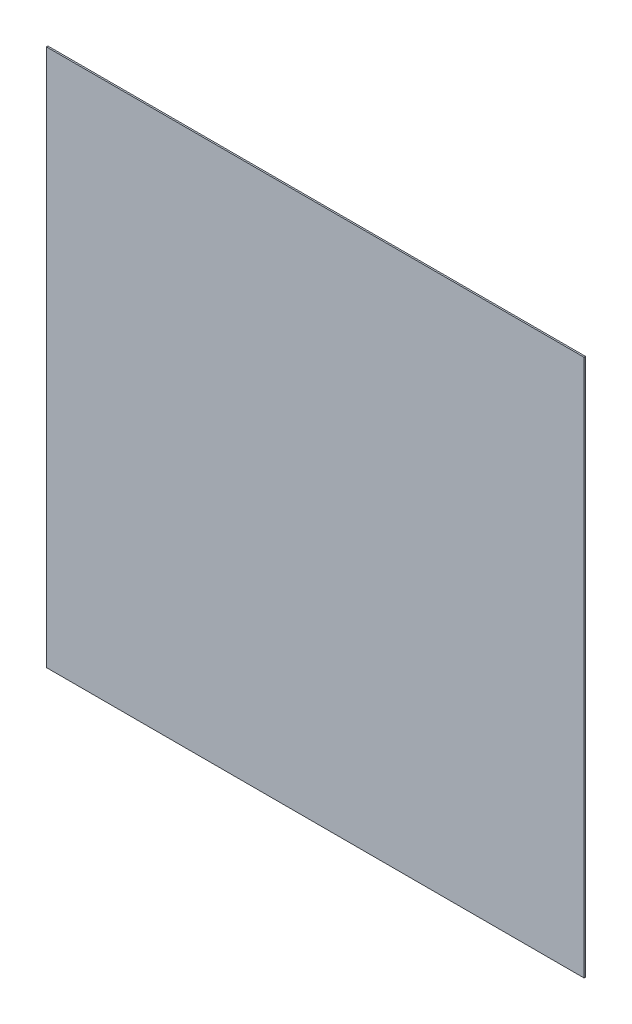
ISO-10303-21;
HEADER;
FILE_DESCRIPTION(('STEP AP214'),'2;1');
FILE_NAME('part.step','',(''),(''),'','','');
FILE_SCHEMA(('AUTOMOTIVE_DESIGN { 1 0 10303 214 1 1 1 1 }'));
ENDSEC;
DATA;
#1=APPLICATION_CONTEXT('core data for automotive mechanical design processes');
#2=APPLICATION_PROTOCOL_DEFINITION('international standard','automotive_design',2000,#1);
#3=PRODUCT_CONTEXT('',#1,'mechanical');
#4=PRODUCT('Part','Part','',(#3));
#5=PRODUCT_RELATED_PRODUCT_CATEGORY('part','',(#4));
#6=PRODUCT_DEFINITION_FORMATION('','',#4);
#7=PRODUCT_DEFINITION_CONTEXT('part definition',#1,'design');
#8=PRODUCT_DEFINITION('design','',#6,#7);
#9=PRODUCT_DEFINITION_SHAPE('','',#8);
#10=(LENGTH_UNIT() NAMED_UNIT(*) SI_UNIT(.MILLI.,.METRE.));
#11=(NAMED_UNIT(*) PLANE_ANGLE_UNIT() SI_UNIT($,.RADIAN.));
#12=(NAMED_UNIT(*) SI_UNIT($,.STERADIAN.) SOLID_ANGLE_UNIT());
#13=UNCERTAINTY_MEASURE_WITH_UNIT(LENGTH_MEASURE(1.E-05),#10,'distance_accuracy_value','');
#14=(GEOMETRIC_REPRESENTATION_CONTEXT(3) GLOBAL_UNCERTAINTY_ASSIGNED_CONTEXT((#13)) GLOBAL_UNIT_ASSIGNED_CONTEXT((#10,
#11,#12)) REPRESENTATION_CONTEXT('',''));
#15=CARTESIAN_POINT('',(0.,0.,0.));
#16=DIRECTION('',(0.,0.,1.));
#17=DIRECTION('',(1.,0.,0.));
#18=AXIS2_PLACEMENT_3D('',#15,#16,#17);
#19=CARTESIAN_POINT('',(900.,1.11022302462516E-13,5.));
#20=DIRECTION('',(1.,0.,0.));
#21=DIRECTION('',(0.,1.,0.));
#22=AXIS2_PLACEMENT_3D('',#19,#20,#21);
#23=PLANE('',#22);
#24=DIRECTION('',(0.,-1.,0.));
#25=VECTOR('',#24,1.);
#26=CARTESIAN_POINT('',(900.,1.11022302462516E-13,0.));
#27=LINE('',#26,#25);
#28=CARTESIAN_POINT('',(900.,900.,0.));
#29=VERTEX_POINT('',#28);
#30=CARTESIAN_POINT('',(900.,-900.,0.));
#31=VERTEX_POINT('',#30);
#32=EDGE_CURVE('E97',#29,#31,#27,.T.);
#33=ORIENTED_EDGE('',*,*,#32,.F.);
#34=DIRECTION('',(0.,0.,-1.));
#35=VECTOR('',#34,1.);
#36=CARTESIAN_POINT('',(900.,900.,5.));
#37=LINE('',#36,#35);
#38=CARTESIAN_POINT('',(900.,900.,5.));
#39=VERTEX_POINT('',#38);
#40=EDGE_CURVE('E11',#39,#29,#37,.T.);
#41=ORIENTED_EDGE('',*,*,#40,.F.);
#42=DIRECTION('',(0.,-1.,0.));
#43=VECTOR('',#42,1.);
#44=CARTESIAN_POINT('',(900.,1.11022302462516E-13,5.));
#45=LINE('',#44,#43);
#46=CARTESIAN_POINT('',(900.,-900.,5.));
#47=VERTEX_POINT('',#46);
#48=EDGE_CURVE('E91',#39,#47,#45,.T.);
#49=ORIENTED_EDGE('',*,*,#48,.T.);
#50=DIRECTION('',(0.,0.,-1.));
#51=VECTOR('',#50,1.);
#52=CARTESIAN_POINT('',(900.,-900.,5.));
#53=LINE('',#52,#51);
#54=EDGE_CURVE('E72',#47,#31,#53,.T.);
#55=ORIENTED_EDGE('',*,*,#54,.T.);
#56=EDGE_LOOP('',(#33,#41,#49,#55));
#57=FACE_BOUND('',#56,.T.);
#58=ADVANCED_FACE('F34',(#57),#23,.T.);
#59=CARTESIAN_POINT('',(0.,900.,5.));
#60=DIRECTION('',(0.,1.,0.));
#61=DIRECTION('',(0.,0.,1.));
#62=AXIS2_PLACEMENT_3D('',#59,#60,#61);
#63=PLANE('',#62);
#64=DIRECTION('',(1.,0.,0.));
#65=VECTOR('',#64,1.);
#66=CARTESIAN_POINT('',(0.,900.,0.));
#67=LINE('',#66,#65);
#68=CARTESIAN_POINT('',(-900.,900.,0.));
#69=VERTEX_POINT('',#68);
#70=EDGE_CURVE('E85',#69,#29,#67,.T.);
#71=ORIENTED_EDGE('',*,*,#70,.F.);
#72=DIRECTION('',(0.,0.,-1.));
#73=VECTOR('',#72,1.);
#74=CARTESIAN_POINT('',(-900.,900.,5.));
#75=LINE('',#74,#73);
#76=CARTESIAN_POINT('',(-900.,900.,5.));
#77=VERTEX_POINT('',#76);
#78=EDGE_CURVE('E42',#77,#69,#75,.T.);
#79=ORIENTED_EDGE('',*,*,#78,.F.);
#80=DIRECTION('',(1.,0.,0.));
#81=VECTOR('',#80,1.);
#82=CARTESIAN_POINT('',(0.,900.,5.));
#83=LINE('',#82,#81);
#84=EDGE_CURVE('E83',#77,#39,#83,.T.);
#85=ORIENTED_EDGE('',*,*,#84,.T.);
#86=ORIENTED_EDGE('',*,*,#40,.T.);
#87=EDGE_LOOP('',(#71,#79,#85,#86));
#88=FACE_BOUND('',#87,.T.);
#89=ADVANCED_FACE('F81',(#88),#63,.T.);
#90=CARTESIAN_POINT('',(-900.,-1.11022302462516E-13,5.));
#91=DIRECTION('',(1.,0.,0.));
#92=DIRECTION('',(0.,1.,0.));
#93=AXIS2_PLACEMENT_3D('',#90,#91,#92);
#94=PLANE('',#93);
#95=DIRECTION('',(0.,-1.,0.));
#96=VECTOR('',#95,1.);
#97=CARTESIAN_POINT('',(-900.,-1.11022302462516E-13,0.));
#98=LINE('',#97,#96);
#99=CARTESIAN_POINT('',(-900.,-900.,0.));
#100=VERTEX_POINT('',#99);
#101=EDGE_CURVE('E65',#69,#100,#98,.T.);
#102=ORIENTED_EDGE('',*,*,#101,.T.);
#103=DIRECTION('',(0.,0.,-1.));
#104=VECTOR('',#103,1.);
#105=CARTESIAN_POINT('',(-900.,-900.,5.));
#106=LINE('',#105,#104);
#107=CARTESIAN_POINT('',(-900.,-900.,5.));
#108=VERTEX_POINT('',#107);
#109=EDGE_CURVE('E86',#108,#100,#106,.T.);
#110=ORIENTED_EDGE('',*,*,#109,.F.);
#111=DIRECTION('',(0.,-1.,0.));
#112=VECTOR('',#111,1.);
#113=CARTESIAN_POINT('',(-900.,-1.11022302462516E-13,5.));
#114=LINE('',#113,#112);
#115=EDGE_CURVE('E87',#77,#108,#114,.T.);
#116=ORIENTED_EDGE('',*,*,#115,.F.);
#117=ORIENTED_EDGE('',*,*,#78,.T.);
#118=EDGE_LOOP('',(#102,#110,#116,#117));
#119=FACE_BOUND('',#118,.T.);
#120=ADVANCED_FACE('F88',(#119),#94,.F.);
#121=CARTESIAN_POINT('',(0.,-900.,5.));
#122=DIRECTION('',(0.,1.,0.));
#123=DIRECTION('',(0.,0.,1.));
#124=AXIS2_PLACEMENT_3D('',#121,#122,#123);
#125=PLANE('',#124);
#126=DIRECTION('',(1.,0.,0.));
#127=VECTOR('',#126,1.);
#128=CARTESIAN_POINT('',(0.,-900.,0.));
#129=LINE('',#128,#127);
#130=EDGE_CURVE('E93',#100,#31,#129,.T.);
#131=ORIENTED_EDGE('',*,*,#130,.T.);
#132=ORIENTED_EDGE('',*,*,#54,.F.);
#133=DIRECTION('',(1.,0.,0.));
#134=VECTOR('',#133,1.);
#135=CARTESIAN_POINT('',(0.,-900.,5.));
#136=LINE('',#135,#134);
#137=EDGE_CURVE('E50',#108,#47,#136,.T.);
#138=ORIENTED_EDGE('',*,*,#137,.F.);
#139=ORIENTED_EDGE('',*,*,#109,.T.);
#140=EDGE_LOOP('',(#131,#132,#138,#139));
#141=FACE_BOUND('',#140,.T.);
#142=ADVANCED_FACE('F106',(#141),#125,.F.);
#143=CARTESIAN_POINT('',(0.,0.,5.));
#144=DIRECTION('',(0.,0.,1.));
#145=DIRECTION('',(1.,0.,0.));
#146=AXIS2_PLACEMENT_3D('',#143,#144,#145);
#147=PLANE('',#146);
#148=ORIENTED_EDGE('',*,*,#48,.F.);
#149=ORIENTED_EDGE('',*,*,#84,.F.);
#150=ORIENTED_EDGE('',*,*,#115,.T.);
#151=ORIENTED_EDGE('',*,*,#137,.T.);
#152=EDGE_LOOP('',(#148,#149,#150,#151));
#153=FACE_BOUND('',#152,.T.);
#154=ADVANCED_FACE('F90',(#153),#147,.T.);
#155=CARTESIAN_POINT('',(0.,0.,0.));
#156=DIRECTION('',(0.,0.,1.));
#157=DIRECTION('',(1.,0.,0.));
#158=AXIS2_PLACEMENT_3D('',#155,#156,#157);
#159=PLANE('',#158);
#160=ORIENTED_EDGE('',*,*,#32,.T.);
#161=ORIENTED_EDGE('',*,*,#130,.F.);
#162=ORIENTED_EDGE('',*,*,#101,.F.);
#163=ORIENTED_EDGE('',*,*,#70,.T.);
#164=EDGE_LOOP('',(#160,#161,#162,#163));
#165=FACE_BOUND('',#164,.T.);
#166=ADVANCED_FACE('F108',(#165),#159,.F.);
#167=CLOSED_SHELL('',(#58,#89,#120,#142,#154,#166));
#168=MANIFOLD_SOLID_BREP('B2',#167);
#169=ADVANCED_BREP_SHAPE_REPRESENTATION('',(#18,#168),#14);
#170=SHAPE_DEFINITION_REPRESENTATION(#9,#169);
ENDSEC;
END-ISO-10303-21;
